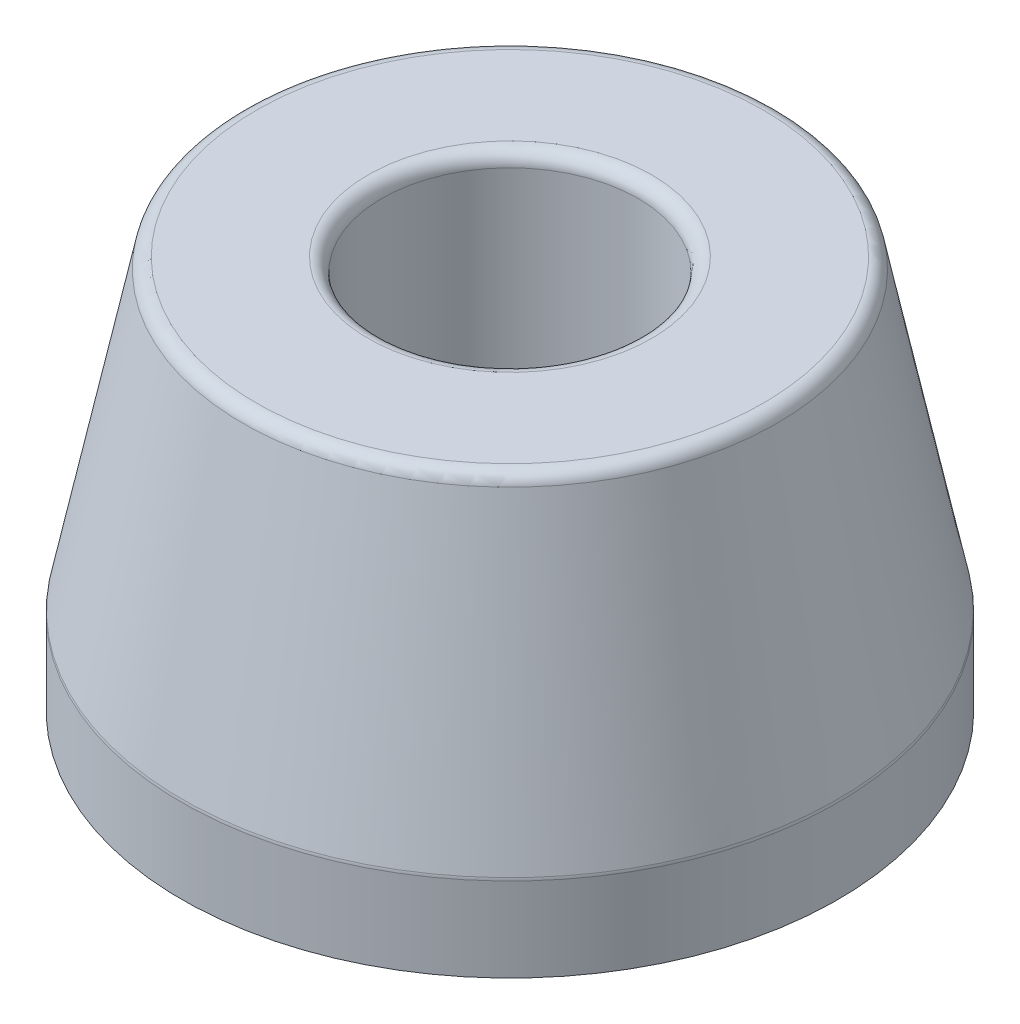
ISO-10303-21;
HEADER;
FILE_DESCRIPTION(('STEP AP214'),'2;1');
FILE_NAME('part.step','',(''),(''),'','','');
FILE_SCHEMA(('AUTOMOTIVE_DESIGN { 1 0 10303 214 1 1 1 1 }'));
ENDSEC;
DATA;
#1=APPLICATION_CONTEXT('core data for automotive mechanical design processes');
#2=APPLICATION_PROTOCOL_DEFINITION('international standard','automotive_design',2000,#1);
#3=PRODUCT_CONTEXT('',#1,'mechanical');
#4=PRODUCT('Part','Part','',(#3));
#5=PRODUCT_RELATED_PRODUCT_CATEGORY('part','',(#4));
#6=PRODUCT_DEFINITION_FORMATION('','',#4);
#7=PRODUCT_DEFINITION_CONTEXT('part definition',#1,'design');
#8=PRODUCT_DEFINITION('design','',#6,#7);
#9=PRODUCT_DEFINITION_SHAPE('','',#8);
#10=(LENGTH_UNIT() NAMED_UNIT(*) SI_UNIT(.MILLI.,.METRE.));
#11=(NAMED_UNIT(*) PLANE_ANGLE_UNIT() SI_UNIT($,.RADIAN.));
#12=(NAMED_UNIT(*) SI_UNIT($,.STERADIAN.) SOLID_ANGLE_UNIT());
#13=UNCERTAINTY_MEASURE_WITH_UNIT(LENGTH_MEASURE(1.E-05),#10,'distance_accuracy_value','');
#14=(GEOMETRIC_REPRESENTATION_CONTEXT(3) GLOBAL_UNCERTAINTY_ASSIGNED_CONTEXT((#13)) GLOBAL_UNIT_ASSIGNED_CONTEXT((#10,
#11,#12)) REPRESENTATION_CONTEXT('',''));
#15=CARTESIAN_POINT('',(0.,0.,0.));
#16=DIRECTION('',(0.,0.,1.));
#17=DIRECTION('',(1.,0.,0.));
#18=AXIS2_PLACEMENT_3D('',#15,#16,#17);
#19=CARTESIAN_POINT('',(12.192,0.,0.));
#20=DIRECTION('',(0.,-1.,0.));
#21=DIRECTION('',(0.,0.,-1.));
#22=AXIS2_PLACEMENT_3D('',#19,#20,#21);
#23=PLANE('',#22);
#24=CARTESIAN_POINT('',(0.,0.,0.));
#25=DIRECTION('',(0.,-1.,0.));
#26=DIRECTION('',(0.,0.,-1.));
#27=AXIS2_PLACEMENT_3D('',#24,#25,#26);
#28=CIRCLE('',#27,12.192);
#29=CARTESIAN_POINT('',(0.,0.,-12.192));
#30=VERTEX_POINT('',#29);
#31=EDGE_CURVE('E58',#30,#30,#28,.T.);
#32=ORIENTED_EDGE('',*,*,#31,.T.);
#33=EDGE_LOOP('',(#32));
#34=FACE_BOUND('',#33,.T.);
#35=CARTESIAN_POINT('',(0.,0.,0.));
#36=DIRECTION('',(0.,-1.,0.));
#37=DIRECTION('',(0.,0.,-1.));
#38=AXIS2_PLACEMENT_3D('',#35,#36,#37);
#39=CIRCLE('',#38,4.7625);
#40=CARTESIAN_POINT('',(0.,0.,-4.7625));
#41=VERTEX_POINT('',#40);
#42=EDGE_CURVE('E10',#41,#41,#39,.T.);
#43=ORIENTED_EDGE('',*,*,#42,.F.);
#44=EDGE_LOOP('',(#43));
#45=FACE_BOUND('',#44,.T.);
#46=ADVANCED_FACE('F30',(#34,#45),#23,.T.);
#47=CARTESIAN_POINT('',(0.,0.,0.));
#48=DIRECTION('',(0.,-1.,0.));
#49=DIRECTION('',(0.,0.,-1.));
#50=AXIS2_PLACEMENT_3D('',#47,#48,#49);
#51=CYLINDRICAL_SURFACE('',#50,4.7625);
#52=ORIENTED_EDGE('',*,*,#42,.T.);
#53=EDGE_LOOP('',(#52));
#54=FACE_BOUND('',#53,.T.);
#55=CARTESIAN_POINT('',(0.,14.097,0.));
#56=DIRECTION('',(0.,-1.,0.));
#57=DIRECTION('',(0.,0.,-1.));
#58=AXIS2_PLACEMENT_3D('',#55,#56,#57);
#59=CIRCLE('',#58,4.7625);
#60=CARTESIAN_POINT('',(0.,14.097,-4.7625));
#61=VERTEX_POINT('',#60);
#62=EDGE_CURVE('E36',#61,#61,#59,.T.);
#63=ORIENTED_EDGE('',*,*,#62,.F.);
#64=EDGE_LOOP('',(#63));
#65=FACE_BOUND('',#64,.T.);
#66=ADVANCED_FACE('F76',(#54,#65),#51,.F.);
#67=CARTESIAN_POINT('',(0.,14.097,0.));
#68=DIRECTION('',(0.,-1.,0.));
#69=DIRECTION('',(0.,0.,-1.));
#70=AXIS2_PLACEMENT_3D('',#67,#68,#69);
#71=TOROIDAL_SURFACE('',#70,5.2705,0.508);
#72=ORIENTED_EDGE('',*,*,#62,.T.);
#73=EDGE_LOOP('',(#72));
#74=FACE_BOUND('',#73,.T.);
#75=CARTESIAN_POINT('',(0.,14.605,0.));
#76=DIRECTION('',(0.,-1.,0.));
#77=DIRECTION('',(0.,0.,-1.));
#78=AXIS2_PLACEMENT_3D('',#75,#76,#77);
#79=CIRCLE('',#78,5.2705);
#80=CARTESIAN_POINT('',(0.,14.605,-5.2705));
#81=VERTEX_POINT('',#80);
#82=EDGE_CURVE('E40',#81,#81,#79,.T.);
#83=ORIENTED_EDGE('',*,*,#82,.F.);
#84=EDGE_LOOP('',(#83));
#85=FACE_BOUND('',#84,.T.);
#86=ADVANCED_FACE('F80',(#74,#85),#71,.T.);
#87=CARTESIAN_POINT('',(5.2705,14.605,0.));
#88=DIRECTION('',(0.,1.,0.));
#89=DIRECTION('',(0.,0.,1.));
#90=AXIS2_PLACEMENT_3D('',#87,#88,#89);
#91=PLANE('',#90);
#92=ORIENTED_EDGE('',*,*,#82,.T.);
#93=EDGE_LOOP('',(#92));
#94=FACE_BOUND('',#93,.T.);
#95=CARTESIAN_POINT('',(0.,14.605,0.));
#96=DIRECTION('',(0.,-1.,0.));
#97=DIRECTION('',(0.,0.,-1.));
#98=AXIS2_PLACEMENT_3D('',#95,#96,#97);
#99=CIRCLE('',#98,9.42830097266352);
#100=CARTESIAN_POINT('',(0.,14.605,-9.42830097266352));
#101=VERTEX_POINT('',#100);
#102=EDGE_CURVE('E44',#101,#101,#99,.T.);
#103=ORIENTED_EDGE('',*,*,#102,.F.);
#104=EDGE_LOOP('',(#103));
#105=FACE_BOUND('',#104,.T.);
#106=ADVANCED_FACE('F84',(#94,#105),#91,.T.);
#107=CARTESIAN_POINT('',(0.,14.097,0.));
#108=DIRECTION('',(0.,-1.,0.));
#109=DIRECTION('',(0.,0.,-1.));
#110=AXIS2_PLACEMENT_3D('',#107,#108,#109);
#111=TOROIDAL_SURFACE('',#110,9.42830097266352,0.508);
#112=ORIENTED_EDGE('',*,*,#102,.T.);
#113=EDGE_LOOP('',(#112));
#114=FACE_BOUND('',#113,.T.);
#115=CARTESIAN_POINT('',(0.,14.1992836779905,0.));
#116=DIRECTION('',(0.,-1.,0.));
#117=DIRECTION('',(0.,0.,-1.));
#118=AXIS2_PLACEMENT_3D('',#115,#116,#117);
#119=CIRCLE('',#118,9.92589724396862);
#120=CARTESIAN_POINT('',(0.,14.1992836779905,-9.92589724396862));
#121=VERTEX_POINT('',#120);
#122=EDGE_CURVE('E49',#121,#121,#119,.T.);
#123=ORIENTED_EDGE('',*,*,#122,.F.);
#124=EDGE_LOOP('',(#123));
#125=FACE_BOUND('',#124,.T.);
#126=ADVANCED_FACE('F90',(#114,#125),#111,.T.);
#127=CARTESIAN_POINT('',(0.,3.22561273419141,0.));
#128=DIRECTION('',(0.,-1.,0.));
#129=DIRECTION('',(0.,0.,-1.));
#130=AXIS2_PLACEMENT_3D('',#127,#128,#129);
#131=CONICAL_SURFACE('',#130,12.1815962713051,0.202731688497474);
#132=ORIENTED_EDGE('',*,*,#122,.T.);
#133=EDGE_LOOP('',(#132));
#134=FACE_BOUND('',#133,.T.);
#135=CARTESIAN_POINT('',(0.,3.22561273419141,0.));
#136=DIRECTION('',(0.,-1.,0.));
#137=DIRECTION('',(0.,0.,-1.));
#138=AXIS2_PLACEMENT_3D('',#135,#136,#137);
#139=CIRCLE('',#138,12.1815962713051);
#140=CARTESIAN_POINT('',(0.,3.22561273419141,-12.1815962713051));
#141=VERTEX_POINT('',#140);
#142=EDGE_CURVE('E52',#141,#141,#139,.T.);
#143=ORIENTED_EDGE('',*,*,#142,.F.);
#144=EDGE_LOOP('',(#143));
#145=FACE_BOUND('',#144,.T.);
#146=ADVANCED_FACE('F72',(#134,#145),#131,.T.);
#147=CARTESIAN_POINT('',(0.,3.12332905620091,0.));
#148=DIRECTION('',(0.,-1.,0.));
#149=DIRECTION('',(0.,0.,-1.));
#150=AXIS2_PLACEMENT_3D('',#147,#148,#149);
#151=TOROIDAL_SURFACE('',#150,11.684,0.508);
#152=ORIENTED_EDGE('',*,*,#142,.T.);
#153=EDGE_LOOP('',(#152));
#154=FACE_BOUND('',#153,.T.);
#155=CARTESIAN_POINT('',(0.,3.12332905620091,0.));
#156=DIRECTION('',(0.,-1.,0.));
#157=DIRECTION('',(0.,0.,-1.));
#158=AXIS2_PLACEMENT_3D('',#155,#156,#157);
#159=CIRCLE('',#158,12.192);
#160=CARTESIAN_POINT('',(0.,3.12332905620091,-12.192));
#161=VERTEX_POINT('',#160);
#162=EDGE_CURVE('E55',#161,#161,#159,.T.);
#163=ORIENTED_EDGE('',*,*,#162,.F.);
#164=EDGE_LOOP('',(#163));
#165=FACE_BOUND('',#164,.T.);
#166=ADVANCED_FACE('F66',(#154,#165),#151,.T.);
#167=CARTESIAN_POINT('',(0.,0.,0.));
#168=DIRECTION('',(0.,-1.,0.));
#169=DIRECTION('',(0.,0.,-1.));
#170=AXIS2_PLACEMENT_3D('',#167,#168,#169);
#171=CYLINDRICAL_SURFACE('',#170,12.192);
#172=ORIENTED_EDGE('',*,*,#162,.T.);
#173=EDGE_LOOP('',(#172));
#174=FACE_BOUND('',#173,.T.);
#175=ORIENTED_EDGE('',*,*,#31,.F.);
#176=EDGE_LOOP('',(#175));
#177=FACE_BOUND('',#176,.T.);
#178=ADVANCED_FACE('F64',(#174,#177),#171,.T.);
#179=CLOSED_SHELL('',(#46,#66,#86,#106,#126,#146,#166,#178));
#180=MANIFOLD_SOLID_BREP('B2',#179);
#181=ADVANCED_BREP_SHAPE_REPRESENTATION('',(#18,#180),#14);
#182=SHAPE_DEFINITION_REPRESENTATION(#9,#181);
ENDSEC;
END-ISO-10303-21;
